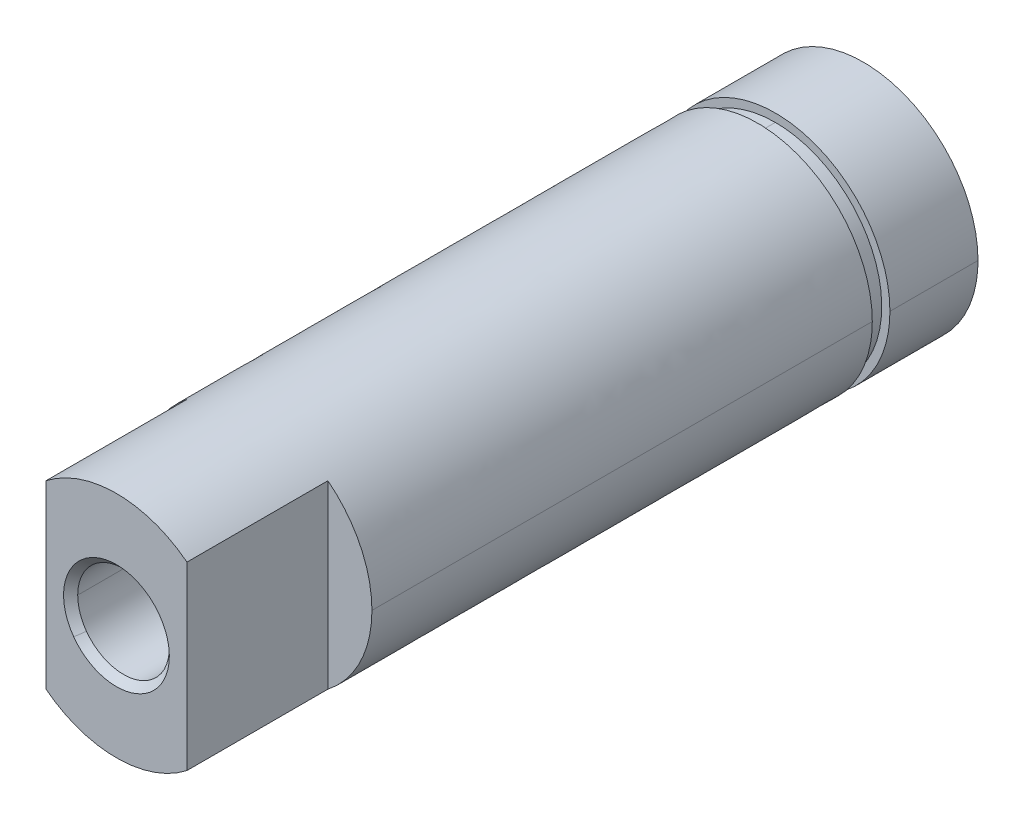
ISO-10303-21;
HEADER;
FILE_DESCRIPTION(('STEP AP214'),'2;1');
FILE_NAME('part.step','',(''),(''),'','','');
FILE_SCHEMA(('AUTOMOTIVE_DESIGN { 1 0 10303 214 1 1 1 1 }'));
ENDSEC;
DATA;
#1=APPLICATION_CONTEXT('core data for automotive mechanical design processes');
#2=APPLICATION_PROTOCOL_DEFINITION('international standard','automotive_design',2000,#1);
#3=PRODUCT_CONTEXT('',#1,'mechanical');
#4=PRODUCT('Part','Part','',(#3));
#5=PRODUCT_RELATED_PRODUCT_CATEGORY('part','',(#4));
#6=PRODUCT_DEFINITION_FORMATION('','',#4);
#7=PRODUCT_DEFINITION_CONTEXT('part definition',#1,'design');
#8=PRODUCT_DEFINITION('design','',#6,#7);
#9=PRODUCT_DEFINITION_SHAPE('','',#8);
#10=(LENGTH_UNIT() NAMED_UNIT(*) SI_UNIT(.MILLI.,.METRE.));
#11=(NAMED_UNIT(*) PLANE_ANGLE_UNIT() SI_UNIT($,.RADIAN.));
#12=(NAMED_UNIT(*) SI_UNIT($,.STERADIAN.) SOLID_ANGLE_UNIT());
#13=UNCERTAINTY_MEASURE_WITH_UNIT(LENGTH_MEASURE(1.E-05),#10,'distance_accuracy_value','');
#14=(GEOMETRIC_REPRESENTATION_CONTEXT(3) GLOBAL_UNCERTAINTY_ASSIGNED_CONTEXT((#13)) GLOBAL_UNIT_ASSIGNED_CONTEXT((#10,
#11,#12)) REPRESENTATION_CONTEXT('',''));
#15=CARTESIAN_POINT('',(0.,0.,0.));
#16=DIRECTION('',(0.,0.,1.));
#17=DIRECTION('',(1.,0.,0.));
#18=AXIS2_PLACEMENT_3D('',#15,#16,#17);
#19=CARTESIAN_POINT('',(3.25,0.,0.));
#20=CARTESIAN_POINT('',(3.25,-3.25,0.));
#21=CARTESIAN_POINT('',(0.,-3.25,0.));
#22=CARTESIAN_POINT('',(-3.25,-3.25,0.));
#23=CARTESIAN_POINT('',(-3.25,0.,0.));
#24=CARTESIAN_POINT('',(3.25,0.,2.5));
#25=CARTESIAN_POINT('',(3.25,-3.25,2.5));
#26=CARTESIAN_POINT('',(0.,-3.25,2.5));
#27=CARTESIAN_POINT('',(-3.25,-3.25,2.5));
#28=CARTESIAN_POINT('',(-3.25,0.,2.5));
#29=(BOUNDED_SURFACE() B_SPLINE_SURFACE(1,2,((#19,#20,#21,#22,#23),(#24,#25,#26,#27,#28)),
.UNSPECIFIED.,.F.,.F.,.F.) B_SPLINE_SURFACE_WITH_KNOTS((2,2),(3,2,3),(-0.384615384615385,
0.384615384615385),(-3.14159265358979,-1.5707963267949,0.),
.UNSPECIFIED.) GEOMETRIC_REPRESENTATION_ITEM() RATIONAL_B_SPLINE_SURFACE(((1.,0.707106781186548,
1.,0.707106781186548,1.),(1.,0.707106781186548,1.,0.707106781186548,1.))) REPRESENTATION_ITEM('') SURFACE());
#30=CARTESIAN_POINT('',(-3.25,0.,0.));
#31=CARTESIAN_POINT('',(-3.25,0.,2.5));
#32=(BOUNDED_CURVE() B_SPLINE_CURVE(1,(#30,#31),.UNSPECIFIED.,.F.,
.F.) B_SPLINE_CURVE_WITH_KNOTS((2,2),(-0.384615384615385,0.384615384615385),
.UNSPECIFIED.) CURVE() GEOMETRIC_REPRESENTATION_ITEM() RATIONAL_B_SPLINE_CURVE((1.,1.)) REPRESENTATION_ITEM(''));
#33=CARTESIAN_POINT('',(-3.25,0.,0.));
#34=VERTEX_POINT('',#33);
#35=CARTESIAN_POINT('',(-3.25,0.,2.5));
#36=VERTEX_POINT('',#35);
#37=EDGE_CURVE('E229',#34,#36,#32,.T.);
#38=CARTESIAN_POINT('',(-3.25,0.,0.));
#39=CARTESIAN_POINT('',(-3.25,-3.25,0.));
#40=CARTESIAN_POINT('',(0.,-3.25,0.));
#41=CARTESIAN_POINT('',(3.25,-3.25,0.));
#42=CARTESIAN_POINT('',(3.25,0.,0.));
#43=(BOUNDED_CURVE() B_SPLINE_CURVE(2,(#38,#39,#40,#41,#42),.UNSPECIFIED.,.F.,
.F.) B_SPLINE_CURVE_WITH_KNOTS((3,2,3),(-3.14159265358979,-1.5707963267949,0.),
.UNSPECIFIED.) CURVE() GEOMETRIC_REPRESENTATION_ITEM() RATIONAL_B_SPLINE_CURVE((1.,
0.707106781186548,1.,0.707106781186548,1.)) REPRESENTATION_ITEM(''));
#44=CARTESIAN_POINT('',(3.25,0.,0.));
#45=VERTEX_POINT('',#44);
#46=EDGE_CURVE('E202',#34,#45,#43,.T.);
#47=CARTESIAN_POINT('',(3.25,0.,0.));
#48=CARTESIAN_POINT('',(3.25,0.,2.5));
#49=(BOUNDED_CURVE() B_SPLINE_CURVE(1,(#47,#48),.UNSPECIFIED.,.F.,
.F.) B_SPLINE_CURVE_WITH_KNOTS((2,2),(-0.384615384615385,0.384615384615385),
.UNSPECIFIED.) CURVE() GEOMETRIC_REPRESENTATION_ITEM() RATIONAL_B_SPLINE_CURVE((1.,1.)) REPRESENTATION_ITEM(''));
#50=CARTESIAN_POINT('',(3.25,0.,2.5));
#51=VERTEX_POINT('',#50);
#52=EDGE_CURVE('E192',#45,#51,#49,.T.);
#53=CARTESIAN_POINT('',(-3.25,0.,2.5));
#54=CARTESIAN_POINT('',(-3.25,-3.25,2.5));
#55=CARTESIAN_POINT('',(0.,-3.25,2.5));
#56=CARTESIAN_POINT('',(3.25,-3.25,2.5));
#57=CARTESIAN_POINT('',(3.25,0.,2.5));
#58=(BOUNDED_CURVE() B_SPLINE_CURVE(2,(#53,#54,#55,#56,#57),.UNSPECIFIED.,.F.,
.F.) B_SPLINE_CURVE_WITH_KNOTS((3,2,3),(-3.14159265358979,-1.5707963267949,0.),
.UNSPECIFIED.) CURVE() GEOMETRIC_REPRESENTATION_ITEM() RATIONAL_B_SPLINE_CURVE((1.,
0.707106781186548,1.,0.707106781186548,1.)) REPRESENTATION_ITEM(''));
#59=EDGE_CURVE('E257',#36,#51,#58,.T.);
#60=ORIENTED_EDGE('',*,*,#37,.F.);
#61=ORIENTED_EDGE('',*,*,#46,.T.);
#62=ORIENTED_EDGE('',*,*,#52,.T.);
#63=ORIENTED_EDGE('',*,*,#59,.F.);
#64=EDGE_LOOP('',(#60,#61,#62,#63));
#65=FACE_BOUND('',#64,.T.);
#66=ADVANCED_FACE('F17',(#65),#29,.T.);
#67=CARTESIAN_POINT('',(0.,3.018225213,3.));
#68=CARTESIAN_POINT('',(-3.018225213,3.018225213,3.));
#69=CARTESIAN_POINT('',(-3.018225213,0.,3.));
#70=CARTESIAN_POINT('',(-3.018225213,-3.018225213,3.));
#71=CARTESIAN_POINT('',(0.,-3.018225213,3.));
#72=CARTESIAN_POINT('',(0.,3.018225213,2.5));
#73=CARTESIAN_POINT('',(-3.018225213,3.018225213,2.5));
#74=CARTESIAN_POINT('',(-3.018225213,0.,2.5));
#75=CARTESIAN_POINT('',(-3.018225213,-3.018225213,2.5));
#76=CARTESIAN_POINT('',(0.,-3.018225213,2.5));
#77=(BOUNDED_SURFACE() B_SPLINE_SURFACE(1,2,((#67,#68,#69,#70,#71),(#72,#73,#74,#75,#76)),
.UNSPECIFIED.,.F.,.F.,.F.) B_SPLINE_SURFACE_WITH_KNOTS((2,2),(3,2,3),(-0.0828301343859986,
0.0828301343859993),(-3.14159265358979,-1.5707963267949,0.),
.UNSPECIFIED.) GEOMETRIC_REPRESENTATION_ITEM() RATIONAL_B_SPLINE_SURFACE(((1.,0.707106781186548,
1.,0.707106781186548,1.),(1.,0.707106781186548,1.,0.707106781186548,1.))) REPRESENTATION_ITEM('') SURFACE());
#78=CARTESIAN_POINT('',(0.,-3.018225213,3.));
#79=CARTESIAN_POINT('',(0.,-3.018225213,2.5));
#80=(BOUNDED_CURVE() B_SPLINE_CURVE(1,(#78,#79),.UNSPECIFIED.,.F.,
.F.) B_SPLINE_CURVE_WITH_KNOTS((2,2),(-0.0828301343859986,0.0828301343859993),
.UNSPECIFIED.) CURVE() GEOMETRIC_REPRESENTATION_ITEM() RATIONAL_B_SPLINE_CURVE((1.,1.)) REPRESENTATION_ITEM(''));
#81=CARTESIAN_POINT('',(0.,-3.018225213,3.));
#82=VERTEX_POINT('',#81);
#83=CARTESIAN_POINT('',(0.,-3.018225213,2.5));
#84=VERTEX_POINT('',#83);
#85=EDGE_CURVE('E191',#82,#84,#80,.T.);
#86=CARTESIAN_POINT('',(0.,3.018225213,3.));
#87=CARTESIAN_POINT('',(-3.018225213,3.018225213,3.));
#88=CARTESIAN_POINT('',(-3.018225213,0.,3.));
#89=CARTESIAN_POINT('',(-3.018225213,-3.018225213,3.));
#90=CARTESIAN_POINT('',(0.,-3.018225213,3.));
#91=(BOUNDED_CURVE() B_SPLINE_CURVE(2,(#86,#87,#88,#89,#90),.UNSPECIFIED.,.F.,
.F.) B_SPLINE_CURVE_WITH_KNOTS((3,2,3),(1.5707963267949,3.14159265358979,4.71238898038469),
.UNSPECIFIED.) CURVE() GEOMETRIC_REPRESENTATION_ITEM() RATIONAL_B_SPLINE_CURVE((1.,
0.707106781186548,1.,0.707106781186548,1.)) REPRESENTATION_ITEM(''));
#92=CARTESIAN_POINT('',(0.,3.018225213,3.));
#93=VERTEX_POINT('',#92);
#94=EDGE_CURVE('E201',#93,#82,#91,.T.);
#95=CARTESIAN_POINT('',(0.,3.018225213,3.));
#96=CARTESIAN_POINT('',(0.,3.018225213,2.5));
#97=(BOUNDED_CURVE() B_SPLINE_CURVE(1,(#95,#96),.UNSPECIFIED.,.F.,
.F.) B_SPLINE_CURVE_WITH_KNOTS((2,2),(-0.0828301343859986,0.0828301343859993),
.UNSPECIFIED.) CURVE() GEOMETRIC_REPRESENTATION_ITEM() RATIONAL_B_SPLINE_CURVE((1.,1.)) REPRESENTATION_ITEM(''));
#98=CARTESIAN_POINT('',(0.,3.018225213,2.5));
#99=VERTEX_POINT('',#98);
#100=EDGE_CURVE('E23',#93,#99,#97,.T.);
#101=CARTESIAN_POINT('',(0.,3.018225213,2.5));
#102=CARTESIAN_POINT('',(-3.018225213,3.018225213,2.5));
#103=CARTESIAN_POINT('',(-3.018225213,0.,2.5));
#104=CARTESIAN_POINT('',(-3.018225213,-3.018225213,2.5));
#105=CARTESIAN_POINT('',(0.,-3.018225213,2.5));
#106=(BOUNDED_CURVE() B_SPLINE_CURVE(2,(#101,#102,#103,#104,#105),.UNSPECIFIED.,.F.,
.F.) B_SPLINE_CURVE_WITH_KNOTS((3,2,3),(1.5707963267949,3.14159265358979,4.71238898038469),
.UNSPECIFIED.) CURVE() GEOMETRIC_REPRESENTATION_ITEM() RATIONAL_B_SPLINE_CURVE((1.,
0.707106781186548,1.,0.707106781186548,1.)) REPRESENTATION_ITEM(''));
#107=EDGE_CURVE('E213',#99,#84,#106,.T.);
#108=ORIENTED_EDGE('',*,*,#85,.F.);
#109=ORIENTED_EDGE('',*,*,#94,.F.);
#110=ORIENTED_EDGE('',*,*,#100,.T.);
#111=ORIENTED_EDGE('',*,*,#107,.T.);
#112=EDGE_LOOP('',(#108,#109,#110,#111));
#113=FACE_BOUND('',#112,.T.);
#114=ADVANCED_FACE('F368',(#113),#77,.T.);
#115=CARTESIAN_POINT('',(-1.05172209268741,-0.764120827980221,21.));
#116=CARTESIAN_POINT('',(-0.287601264707204,-1.81584292066763,21.));
#117=CARTESIAN_POINT('',(0.764120827980206,-1.05172209268742,21.));
#118=CARTESIAN_POINT('',(1.81584292066762,-0.287601264707213,21.));
#119=CARTESIAN_POINT('',(1.05172209268741,0.764120827980197,21.));
#120=CARTESIAN_POINT('',(-1.21352549156242,-0.881677878438728,21.2));
#121=CARTESIAN_POINT('',(-0.331847613123702,-2.09520337000114,21.2));
#122=CARTESIAN_POINT('',(0.881677878438712,-1.21352549156243,21.2));
#123=CARTESIAN_POINT('',(2.09520337000113,-0.331847613123711,21.2));
#124=CARTESIAN_POINT('',(1.21352549156241,0.881677878438703,21.2));
#125=(BOUNDED_SURFACE() B_SPLINE_SURFACE(1,2,((#115,#116,#117,#118,#119),(#120,#121,#122,#123,
#124)),.UNSPECIFIED.,.F.,.F.,.F.) B_SPLINE_SURFACE_WITH_KNOTS((2,2),(3,2,3),
(-0.0214274782178067,0.192847303959953),(-3.14159265358979,-1.5707963267949,0.),
.UNSPECIFIED.) GEOMETRIC_REPRESENTATION_ITEM() RATIONAL_B_SPLINE_SURFACE(((1.,0.707106781186548,
1.,0.707106781186548,1.),(1.,0.707106781186548,1.,0.707106781186548,1.))) REPRESENTATION_ITEM('') SURFACE());
#126=CARTESIAN_POINT('',(1.05172209268742,0.764120827980206,21.));
#127=CARTESIAN_POINT('',(1.21352549156241,0.881677878438703,21.2));
#128=(BOUNDED_CURVE() B_SPLINE_CURVE(1,(#126,#127),.UNSPECIFIED.,.F.,
.F.) B_SPLINE_CURVE_WITH_KNOTS((2,2),(-0.0214274782178067,0.192847303959953),
.UNSPECIFIED.) CURVE() GEOMETRIC_REPRESENTATION_ITEM() RATIONAL_B_SPLINE_CURVE((1.,1.)) REPRESENTATION_ITEM(''));
#129=CARTESIAN_POINT('',(1.05172209268742,0.764120827980206,21.));
#130=VERTEX_POINT('',#129);
#131=CARTESIAN_POINT('',(1.21352549156241,0.881677878438703,21.2));
#132=VERTEX_POINT('',#131);
#133=EDGE_CURVE('E154',#130,#132,#128,.T.);
#134=CARTESIAN_POINT('',(1.3,0.,21.));
#135=CARTESIAN_POINT('',(1.3,0.422395605102777,21.));
#136=CARTESIAN_POINT('',(1.05172209268742,0.764120827980206,21.));
#137=(BOUNDED_CURVE() B_SPLINE_CURVE(2,(#134,#135,#136),.UNSPECIFIED.,.F.,
.F.) B_SPLINE_CURVE_WITH_KNOTS((3,3),(-6.28318530717959,-5.6470149373922),
.UNSPECIFIED.) CURVE() GEOMETRIC_REPRESENTATION_ITEM() RATIONAL_B_SPLINE_CURVE((1.,
0.881378645886596,0.858840265006243)) REPRESENTATION_ITEM(''));
#138=CARTESIAN_POINT('',(1.3,0.,21.));
#139=VERTEX_POINT('',#138);
#140=EDGE_CURVE('E140',#139,#130,#137,.T.);
#141=CARTESIAN_POINT('',(-1.05172209268741,-0.764120827980221,21.));
#142=CARTESIAN_POINT('',(-0.496555814625122,-1.52824165596043,21.));
#143=CARTESIAN_POINT('',(0.401722092687439,-1.2363734711837,21.));
#144=CARTESIAN_POINT('',(1.3,-0.944505286406964,21.));
#145=CARTESIAN_POINT('',(1.3,0.,21.));
#146=(BOUNDED_CURVE() B_SPLINE_CURVE(2,(#141,#142,#143,#144,#145),.UNSPECIFIED.,.F.,
.F.) B_SPLINE_CURVE_WITH_KNOTS((3,2,3),(-2.51327412287182,-1.25663706143591,0.),
.UNSPECIFIED.) CURVE() GEOMETRIC_REPRESENTATION_ITEM() RATIONAL_B_SPLINE_CURVE((1.,
0.809016994374948,1.,0.809016994374949,1.)) REPRESENTATION_ITEM(''));
#147=CARTESIAN_POINT('',(-1.05172209268741,-0.764120827980221,21.));
#148=VERTEX_POINT('',#147);
#149=EDGE_CURVE('E11',#148,#139,#146,.T.);
#150=CARTESIAN_POINT('',(-1.05172209268741,-0.764120827980221,21.));
#151=CARTESIAN_POINT('',(-1.21352549156242,-0.881677878438728,21.2));
#152=(BOUNDED_CURVE() B_SPLINE_CURVE(1,(#150,#151),.UNSPECIFIED.,.F.,
.F.) B_SPLINE_CURVE_WITH_KNOTS((2,2),(-0.0214274782178067,0.192847303959953),
.UNSPECIFIED.) CURVE() GEOMETRIC_REPRESENTATION_ITEM() RATIONAL_B_SPLINE_CURVE((1.,1.)) REPRESENTATION_ITEM(''));
#153=CARTESIAN_POINT('',(-1.21352549156242,-0.881677878438728,21.2));
#154=VERTEX_POINT('',#153);
#155=EDGE_CURVE('E301',#148,#154,#152,.T.);
#156=CARTESIAN_POINT('',(1.5,0.,21.2));
#157=CARTESIAN_POINT('',(1.5,-1.08981379200804,21.2));
#158=CARTESIAN_POINT('',(0.463525491562429,-1.42658477444273,21.2));
#159=CARTESIAN_POINT('',(-0.572949016875142,-1.76335575687742,21.2));
#160=CARTESIAN_POINT('',(-1.21352549156242,-0.881677878438728,21.2));
#161=(BOUNDED_CURVE() B_SPLINE_CURVE(2,(#156,#157,#158,#159,#160),.UNSPECIFIED.,.F.,
.F.) B_SPLINE_CURVE_WITH_KNOTS((3,2,3),(0.,1.2566370614359,2.51327412287182),
.UNSPECIFIED.) CURVE() GEOMETRIC_REPRESENTATION_ITEM() RATIONAL_B_SPLINE_CURVE((1.,
0.809016994374949,1.,0.80901699437495,1.)) REPRESENTATION_ITEM(''));
#162=CARTESIAN_POINT('',(1.5,0.,21.2));
#163=VERTEX_POINT('',#162);
#164=EDGE_CURVE('E284',#163,#154,#161,.T.);
#165=CARTESIAN_POINT('',(1.21352549156241,0.881677878438703,21.2));
#166=CARTESIAN_POINT('',(1.5,0.487379544349362,21.2));
#167=CARTESIAN_POINT('',(1.5,0.,21.2));
#168=(BOUNDED_CURVE() B_SPLINE_CURVE(2,(#165,#166,#167),.UNSPECIFIED.,.F.,
.F.) B_SPLINE_CURVE_WITH_KNOTS((3,3),(5.65486677646162,6.28318530717958),
.UNSPECIFIED.) CURVE() GEOMETRIC_REPRESENTATION_ITEM() RATIONAL_B_SPLINE_CURVE((0.904508497187473,
0.904508497187473,1.)) REPRESENTATION_ITEM(''));
#169=EDGE_CURVE('E32',#132,#163,#168,.T.);
#170=ORIENTED_EDGE('',*,*,#133,.F.);
#171=ORIENTED_EDGE('',*,*,#140,.F.);
#172=ORIENTED_EDGE('',*,*,#149,.F.);
#173=ORIENTED_EDGE('',*,*,#155,.T.);
#174=ORIENTED_EDGE('',*,*,#164,.F.);
#175=ORIENTED_EDGE('',*,*,#169,.F.);
#176=EDGE_LOOP('',(#170,#171,#172,#173,#174,#175));
#177=FACE_BOUND('',#176,.T.);
#178=ADVANCED_FACE('F155',(#177),#125,.T.);
#179=CARTESIAN_POINT('',(-1.3,0.,6.2));
#180=CARTESIAN_POINT('',(-1.3,-1.3,6.2));
#181=CARTESIAN_POINT('',(0.,-1.3,6.2));
#182=CARTESIAN_POINT('',(1.3,-1.3,6.2));
#183=CARTESIAN_POINT('',(1.3,0.,6.2));
#184=CARTESIAN_POINT('',(-1.3,0.,21.));
#185=CARTESIAN_POINT('',(-1.3,-1.3,21.));
#186=CARTESIAN_POINT('',(0.,-1.3,21.));
#187=CARTESIAN_POINT('',(1.3,-1.3,21.));
#188=CARTESIAN_POINT('',(1.3,0.,21.));
#189=(BOUNDED_SURFACE() B_SPLINE_SURFACE(1,2,((#179,#180,#181,#182,#183),(#184,#185,#186,#187,
#188)),.UNSPECIFIED.,.F.,.F.,.F.) B_SPLINE_SURFACE_WITH_KNOTS((2,2),(3,2,3),(-5.69230769230769,
5.69230769230769),(-3.14159265358979,-1.5707963267949,0.),
.UNSPECIFIED.) GEOMETRIC_REPRESENTATION_ITEM() RATIONAL_B_SPLINE_SURFACE(((1.,0.707106781186548,
1.,0.707106781186548,1.),(1.,0.707106781186548,1.,0.707106781186548,1.))) REPRESENTATION_ITEM('') SURFACE());
#190=CARTESIAN_POINT('',(1.3,0.,6.2));
#191=CARTESIAN_POINT('',(1.3,0.,21.));
#192=(BOUNDED_CURVE() B_SPLINE_CURVE(1,(#190,#191),.UNSPECIFIED.,.F.,
.F.) B_SPLINE_CURVE_WITH_KNOTS((2,2),(-5.69230769230769,5.69230769230769),
.UNSPECIFIED.) CURVE() GEOMETRIC_REPRESENTATION_ITEM() RATIONAL_B_SPLINE_CURVE((1.,1.)) REPRESENTATION_ITEM(''));
#193=CARTESIAN_POINT('',(1.3,0.,6.2));
#194=VERTEX_POINT('',#193);
#195=EDGE_CURVE('E148',#194,#139,#192,.T.);
#196=CARTESIAN_POINT('',(-1.3,0.,6.2));
#197=CARTESIAN_POINT('',(-1.3,-1.3,6.2));
#198=CARTESIAN_POINT('',(0.,-1.3,6.2));
#199=CARTESIAN_POINT('',(1.3,-1.3,6.2));
#200=CARTESIAN_POINT('',(1.3,0.,6.2));
#201=(BOUNDED_CURVE() B_SPLINE_CURVE(2,(#196,#197,#198,#199,#200),.UNSPECIFIED.,.F.,
.F.) B_SPLINE_CURVE_WITH_KNOTS((3,2,3),(-3.14159265358979,-1.5707963267949,0.),
.UNSPECIFIED.) CURVE() GEOMETRIC_REPRESENTATION_ITEM() RATIONAL_B_SPLINE_CURVE((1.,
0.707106781186548,1.,0.707106781186548,1.)) REPRESENTATION_ITEM(''));
#202=CARTESIAN_POINT('',(-1.3,0.,6.2));
#203=VERTEX_POINT('',#202);
#204=EDGE_CURVE('E302',#203,#194,#201,.T.);
#205=CARTESIAN_POINT('',(-1.3,0.,6.2));
#206=CARTESIAN_POINT('',(-1.3,0.,21.));
#207=(BOUNDED_CURVE() B_SPLINE_CURVE(1,(#205,#206),.UNSPECIFIED.,.F.,
.F.) B_SPLINE_CURVE_WITH_KNOTS((2,2),(-5.69230769230769,5.69230769230769),
.UNSPECIFIED.) CURVE() GEOMETRIC_REPRESENTATION_ITEM() RATIONAL_B_SPLINE_CURVE((1.,1.)) REPRESENTATION_ITEM(''));
#208=CARTESIAN_POINT('',(-1.3,0.,21.));
#209=VERTEX_POINT('',#208);
#210=EDGE_CURVE('E151',#203,#209,#207,.T.);
#211=CARTESIAN_POINT('',(-1.3,0.,21.));
#212=CARTESIAN_POINT('',(-1.3,-0.422395605102787,21.));
#213=CARTESIAN_POINT('',(-1.05172209268741,-0.764120827980221,21.));
#214=(BOUNDED_CURVE() B_SPLINE_CURVE(2,(#211,#212,#213),.UNSPECIFIED.,.F.,
.F.) B_SPLINE_CURVE_WITH_KNOTS((3,3),(-3.14159265358979,-2.51327412287182),
.UNSPECIFIED.) CURVE() GEOMETRIC_REPRESENTATION_ITEM() RATIONAL_B_SPLINE_CURVE((1.,
0.95105651629515,1.)) REPRESENTATION_ITEM(''));
#215=EDGE_CURVE('E165',#209,#148,#214,.T.);
#216=ORIENTED_EDGE('',*,*,#195,.F.);
#217=ORIENTED_EDGE('',*,*,#204,.F.);
#218=ORIENTED_EDGE('',*,*,#210,.T.);
#219=ORIENTED_EDGE('',*,*,#215,.T.);
#220=ORIENTED_EDGE('',*,*,#149,.T.);
#221=EDGE_LOOP('',(#216,#217,#218,#219,#220));
#222=FACE_BOUND('',#221,.T.);
#223=ADVANCED_FACE('F393',(#222),#189,.T.);
#224=CARTESIAN_POINT('',(3.25,0.,3.));
#225=CARTESIAN_POINT('',(3.25,-3.25,3.));
#226=CARTESIAN_POINT('',(0.,-3.25,3.));
#227=CARTESIAN_POINT('',(-3.25,-3.25,3.));
#228=CARTESIAN_POINT('',(-3.25,0.,3.));
#229=CARTESIAN_POINT('',(3.25,0.,21.2));
#230=CARTESIAN_POINT('',(3.25,-3.25,21.2));
#231=CARTESIAN_POINT('',(0.,-3.25,21.2));
#232=CARTESIAN_POINT('',(-3.25,-3.25,21.2));
#233=CARTESIAN_POINT('',(-3.25,0.,21.2));
#234=(BOUNDED_SURFACE() B_SPLINE_SURFACE(1,2,((#224,#225,#226,#227,#228),(#229,#230,#231,#232,
#233)),.UNSPECIFIED.,.F.,.F.,.F.) B_SPLINE_SURFACE_WITH_KNOTS((2,2),(3,2,3),(-2.8,2.8),
(-3.14159265358979,-1.5707963267949,0.),
.UNSPECIFIED.) GEOMETRIC_REPRESENTATION_ITEM() RATIONAL_B_SPLINE_SURFACE(((1.,0.707106781186548,
1.,0.707106781186548,1.),(1.,0.707106781186548,1.,0.707106781186548,1.))) REPRESENTATION_ITEM('') SURFACE());
#235=CARTESIAN_POINT('',(-3.25,0.,3.));
#236=CARTESIAN_POINT('',(-3.25,0.,17.2));
#237=(BOUNDED_CURVE() B_SPLINE_CURVE(1,(#235,#236),.UNSPECIFIED.,.F.,
.F.) B_SPLINE_CURVE_WITH_KNOTS((2,2),(-2.8,1.56923076923077),
.UNSPECIFIED.) CURVE() GEOMETRIC_REPRESENTATION_ITEM() RATIONAL_B_SPLINE_CURVE((1.,1.)) REPRESENTATION_ITEM(''));
#238=CARTESIAN_POINT('',(-3.25,0.,3.));
#239=VERTEX_POINT('',#238);
#240=CARTESIAN_POINT('',(-3.25,0.,17.2));
#241=VERTEX_POINT('',#240);
#242=EDGE_CURVE('E249',#239,#241,#237,.T.);
#243=CARTESIAN_POINT('',(-3.25,0.,3.));
#244=CARTESIAN_POINT('',(-3.25,-3.25,3.));
#245=CARTESIAN_POINT('',(0.,-3.25,3.));
#246=CARTESIAN_POINT('',(3.25,-3.25,3.));
#247=CARTESIAN_POINT('',(3.25,0.,3.));
#248=(BOUNDED_CURVE() B_SPLINE_CURVE(2,(#243,#244,#245,#246,#247),.UNSPECIFIED.,.F.,
.F.) B_SPLINE_CURVE_WITH_KNOTS((3,2,3),(-3.14159265358979,-1.5707963267949,0.),
.UNSPECIFIED.) CURVE() GEOMETRIC_REPRESENTATION_ITEM() RATIONAL_B_SPLINE_CURVE((1.,
0.707106781186548,1.,0.707106781186548,1.)) REPRESENTATION_ITEM(''));
#249=CARTESIAN_POINT('',(3.25,0.,3.));
#250=VERTEX_POINT('',#249);
#251=EDGE_CURVE('E193',#239,#250,#248,.T.);
#252=CARTESIAN_POINT('',(3.25,0.,3.));
#253=CARTESIAN_POINT('',(3.25,0.,17.2));
#254=(BOUNDED_CURVE() B_SPLINE_CURVE(1,(#252,#253),.UNSPECIFIED.,.F.,
.F.) B_SPLINE_CURVE_WITH_KNOTS((2,2),(-2.8,1.56923076923077),
.UNSPECIFIED.) CURVE() GEOMETRIC_REPRESENTATION_ITEM() RATIONAL_B_SPLINE_CURVE((1.,1.)) REPRESENTATION_ITEM(''));
#255=CARTESIAN_POINT('',(3.25,0.,17.2));
#256=VERTEX_POINT('',#255);
#257=EDGE_CURVE('E179',#250,#256,#254,.T.);
#258=CARTESIAN_POINT('',(3.25,0.,17.2));
#259=CARTESIAN_POINT('',(3.25,-1.58583761835474,17.2));
#260=CARTESIAN_POINT('',(2.,-2.561737691,17.2));
#261=(BOUNDED_CURVE() B_SPLINE_CURVE(2,(#258,#259,#260),.UNSPECIFIED.,.F.,
.F.) B_SPLINE_CURVE_WITH_KNOTS((3,3),(0.907922503144761,1.81584500619676),
.UNSPECIFIED.) CURVE() GEOMETRIC_REPRESENTATION_ITEM() RATIONAL_B_SPLINE_CURVE((1.,
0.898717034293257,1.)) REPRESENTATION_ITEM(''));
#262=CARTESIAN_POINT('',(2.,-2.561737691,17.2));
#263=VERTEX_POINT('',#262);
#264=EDGE_CURVE('E222',#256,#263,#261,.T.);
#265=CARTESIAN_POINT('',(2.,-2.561737691,17.2));
#266=CARTESIAN_POINT('',(2.,-2.561737691,21.2));
#267=(BOUNDED_CURVE() B_SPLINE_CURVE(1,(#265,#266),.UNSPECIFIED.,.F.,
.F.) B_SPLINE_CURVE_WITH_KNOTS((2,2),(0.,1.),
.UNSPECIFIED.) CURVE() GEOMETRIC_REPRESENTATION_ITEM() RATIONAL_B_SPLINE_CURVE((1.,1.)) REPRESENTATION_ITEM(''));
#268=CARTESIAN_POINT('',(2.,-2.561737691,21.2));
#269=VERTEX_POINT('',#268);
#270=EDGE_CURVE('E212',#263,#269,#267,.T.);
#271=CARTESIAN_POINT('',(-2.,-2.561737691,21.2));
#272=CARTESIAN_POINT('',(0.,-4.12317780801626,21.2));
#273=CARTESIAN_POINT('',(2.,-2.561737691,21.2));
#274=(BOUNDED_CURVE() B_SPLINE_CURVE(2,(#271,#272,#273),.UNSPECIFIED.,.F.,
.F.) B_SPLINE_CURVE_WITH_KNOTS((3,3),(-2.23367015053779,-0.907922503051999),
.UNSPECIFIED.) CURVE() GEOMETRIC_REPRESENTATION_ITEM() RATIONAL_B_SPLINE_CURVE((1.,
0.788226981939809,1.)) REPRESENTATION_ITEM(''));
#275=CARTESIAN_POINT('',(-2.,-2.561737691,21.2));
#276=VERTEX_POINT('',#275);
#277=EDGE_CURVE('E292',#276,#269,#274,.T.);
#278=CARTESIAN_POINT('',(-2.,-2.561737691,21.2));
#279=CARTESIAN_POINT('',(-2.,-2.561737691,17.2));
#280=(BOUNDED_CURVE() B_SPLINE_CURVE(1,(#278,#279),.UNSPECIFIED.,.F.,
.F.) B_SPLINE_CURVE_WITH_KNOTS((2,2),(0.,1.),
.UNSPECIFIED.) CURVE() GEOMETRIC_REPRESENTATION_ITEM() RATIONAL_B_SPLINE_CURVE((1.,1.)) REPRESENTATION_ITEM(''));
#281=CARTESIAN_POINT('',(-2.,-2.561737691,17.2));
#282=VERTEX_POINT('',#281);
#283=EDGE_CURVE('E282',#276,#282,#280,.T.);
#284=CARTESIAN_POINT('',(-2.,-2.561737691,17.2));
#285=CARTESIAN_POINT('',(-3.25,-1.58583761835474,17.2));
#286=CARTESIAN_POINT('',(-3.25,0.,17.2));
#287=(BOUNDED_CURVE() B_SPLINE_CURVE(2,(#284,#285,#286),.UNSPECIFIED.,.F.,
.F.) B_SPLINE_CURVE_WITH_KNOTS((3,3),(-0.907922503051999,0.),
.UNSPECIFIED.) CURVE() GEOMETRIC_REPRESENTATION_ITEM() RATIONAL_B_SPLINE_CURVE((1.,
0.898717034293258,1.)) REPRESENTATION_ITEM(''));
#288=EDGE_CURVE('E310',#282,#241,#287,.T.);
#289=ORIENTED_EDGE('',*,*,#242,.F.);
#290=ORIENTED_EDGE('',*,*,#251,.T.);
#291=ORIENTED_EDGE('',*,*,#257,.T.);
#292=ORIENTED_EDGE('',*,*,#264,.T.);
#293=ORIENTED_EDGE('',*,*,#270,.T.);
#294=ORIENTED_EDGE('',*,*,#277,.F.);
#295=ORIENTED_EDGE('',*,*,#283,.T.);
#296=ORIENTED_EDGE('',*,*,#288,.T.);
#297=EDGE_LOOP('',(#289,#290,#291,#292,#293,#294,#295,#296));
#298=FACE_BOUND('',#297,.T.);
#299=ADVANCED_FACE('F403',(#298),#234,.T.);
#300=CARTESIAN_POINT('',(-2.01,-4.13317780801626,21.2));
#301=CARTESIAN_POINT('',(-2.01,4.13317780801626,21.2));
#302=CARTESIAN_POINT('',(2.01,-4.13317780801626,21.2));
#303=CARTESIAN_POINT('',(2.01,4.13317780801626,21.2));
#304=(BOUNDED_SURFACE() B_SPLINE_SURFACE(1,1,((#300,#301),(#302,#303)),.UNSPECIFIED.,.F.,.F.,
.F.) B_SPLINE_SURFACE_WITH_KNOTS((2,2),(2,2),(-0.201,0.201),(-0.413317780801626,
0.413317780801626),
.UNSPECIFIED.) GEOMETRIC_REPRESENTATION_ITEM() RATIONAL_B_SPLINE_SURFACE(((1.,1.),(1.,1.))) REPRESENTATION_ITEM('') SURFACE());
#305=CARTESIAN_POINT('',(-1.21352549156242,-0.881677878438728,21.2));
#306=CARTESIAN_POINT('',(-1.85410196624969,0.,21.2));
#307=CARTESIAN_POINT('',(-1.21352549156243,0.881677878438701,21.2));
#308=CARTESIAN_POINT('',(-0.572949016875169,1.76335575687742,21.2));
#309=CARTESIAN_POINT('',(0.463525491562416,1.42658477444273,21.2));
#310=CARTESIAN_POINT('',(0.927050983124841,1.27597621252806,21.2));
#311=CARTESIAN_POINT('',(1.21352549156241,0.881677878438703,21.2));
#312=(BOUNDED_CURVE() B_SPLINE_CURVE(2,(#305,#306,#307,#308,#309,#310,#311),.UNSPECIFIED.,.F.,
.F.) B_SPLINE_CURVE_WITH_KNOTS((3,2,2,3),(2.51327412287182,3.76991118430774,5.02654824574366,
5.65486677646162),
.UNSPECIFIED.) CURVE() GEOMETRIC_REPRESENTATION_ITEM() RATIONAL_B_SPLINE_CURVE((1.,
0.809016994374946,1.,0.809016994374946,1.,0.904508497187473,0.904508497187473)) REPRESENTATION_ITEM(''));
#313=EDGE_CURVE('E159',#154,#132,#312,.T.);
#314=CARTESIAN_POINT('',(2.,2.561737691,21.2));
#315=CARTESIAN_POINT('',(2.,-2.561737691,21.2));
#316=(BOUNDED_CURVE() B_SPLINE_CURVE(1,(#314,#315),.UNSPECIFIED.,.F.,
.F.) B_SPLINE_CURVE_WITH_KNOTS((2,2),(0.,1.),
.UNSPECIFIED.) CURVE() GEOMETRIC_REPRESENTATION_ITEM() RATIONAL_B_SPLINE_CURVE((1.,1.)) REPRESENTATION_ITEM(''));
#317=CARTESIAN_POINT('',(2.,2.561737691,21.2));
#318=VERTEX_POINT('',#317);
#319=EDGE_CURVE('E203',#318,#269,#316,.T.);
#320=CARTESIAN_POINT('',(2.,2.561737691,21.2));
#321=CARTESIAN_POINT('',(0.,4.12317780801626,21.2));
#322=CARTESIAN_POINT('',(-2.,2.561737691,21.2));
#323=(BOUNDED_CURVE() B_SPLINE_CURVE(2,(#320,#321,#322),.UNSPECIFIED.,.F.,
.F.) B_SPLINE_CURVE_WITH_KNOTS((3,3),(0.907922503051999,2.23367015053779),
.UNSPECIFIED.) CURVE() GEOMETRIC_REPRESENTATION_ITEM() RATIONAL_B_SPLINE_CURVE((1.,
0.788226981939809,1.)) REPRESENTATION_ITEM(''));
#324=CARTESIAN_POINT('',(-2.,2.561737691,21.2));
#325=VERTEX_POINT('',#324);
#326=EDGE_CURVE('E478',#318,#325,#323,.T.);
#327=CARTESIAN_POINT('',(-2.,-2.561737691,21.2));
#328=CARTESIAN_POINT('',(-2.,2.561737691,21.2));
#329=(BOUNDED_CURVE() B_SPLINE_CURVE(1,(#327,#328),.UNSPECIFIED.,.F.,
.F.) B_SPLINE_CURVE_WITH_KNOTS((2,2),(0.,1.),
.UNSPECIFIED.) CURVE() GEOMETRIC_REPRESENTATION_ITEM() RATIONAL_B_SPLINE_CURVE((1.,1.)) REPRESENTATION_ITEM(''));
#330=EDGE_CURVE('E283',#276,#325,#329,.T.);
#331=ORIENTED_EDGE('',*,*,#164,.T.);
#332=ORIENTED_EDGE('',*,*,#313,.T.);
#333=ORIENTED_EDGE('',*,*,#169,.T.);
#334=EDGE_LOOP('',(#331,#332,#333));
#335=FACE_BOUND('',#334,.T.);
#336=ORIENTED_EDGE('',*,*,#319,.F.);
#337=ORIENTED_EDGE('',*,*,#326,.T.);
#338=ORIENTED_EDGE('',*,*,#330,.F.);
#339=ORIENTED_EDGE('',*,*,#277,.T.);
#340=EDGE_LOOP('',(#336,#337,#338,#339));
#341=FACE_BOUND('',#340,.T.);
#342=ADVANCED_FACE('F414',(#335,#341),#304,.T.);
#343=CARTESIAN_POINT('',(-1.31,-1.31,6.2));
#344=CARTESIAN_POINT('',(-1.31,1.31,6.2));
#345=CARTESIAN_POINT('',(1.31,-1.31,6.2));
#346=CARTESIAN_POINT('',(1.31,1.31,6.2));
#347=(BOUNDED_SURFACE() B_SPLINE_SURFACE(1,1,((#343,#344),(#345,#346)),.UNSPECIFIED.,.F.,.F.,
.F.) B_SPLINE_SURFACE_WITH_KNOTS((2,2),(2,2),(-0.131,0.131),(-0.131,0.131),
.UNSPECIFIED.) GEOMETRIC_REPRESENTATION_ITEM() RATIONAL_B_SPLINE_SURFACE(((1.,1.),(1.,1.))) REPRESENTATION_ITEM('') SURFACE());
#348=CARTESIAN_POINT('',(1.3,0.,6.2));
#349=CARTESIAN_POINT('',(1.3,1.3,6.2));
#350=CARTESIAN_POINT('',(0.,1.3,6.2));
#351=CARTESIAN_POINT('',(-1.3,1.3,6.2));
#352=CARTESIAN_POINT('',(-1.3,0.,6.2));
#353=(BOUNDED_CURVE() B_SPLINE_CURVE(2,(#348,#349,#350,#351,#352),.UNSPECIFIED.,.F.,
.F.) B_SPLINE_CURVE_WITH_KNOTS((3,2,3),(-6.28318530717959,-4.71238898038469,-3.14159265358979),
.UNSPECIFIED.) CURVE() GEOMETRIC_REPRESENTATION_ITEM() RATIONAL_B_SPLINE_CURVE((1.,
0.707106781186548,1.,0.707106781186548,1.)) REPRESENTATION_ITEM(''));
#354=EDGE_CURVE('E300',#194,#203,#353,.T.);
#355=ORIENTED_EDGE('',*,*,#354,.T.);
#356=ORIENTED_EDGE('',*,*,#204,.T.);
#357=EDGE_LOOP('',(#355,#356));
#358=FACE_BOUND('',#357,.T.);
#359=ADVANCED_FACE('F850',(#358),#347,.T.);
#360=CARTESIAN_POINT('',(-3.26,-2.57173769130438,17.2));
#361=CARTESIAN_POINT('',(-3.26,2.57173769130438,17.2));
#362=CARTESIAN_POINT('',(-1.99,-2.57173769130438,17.2));
#363=CARTESIAN_POINT('',(-1.99,2.57173769130438,17.2));
#364=(BOUNDED_SURFACE() B_SPLINE_SURFACE(1,1,((#360,#361),(#362,#363)),.UNSPECIFIED.,.F.,.F.,
.F.) B_SPLINE_SURFACE_WITH_KNOTS((2,2),(2,2),(0.199,0.326),(-0.257173769130438,
0.257173769130438),
.UNSPECIFIED.) GEOMETRIC_REPRESENTATION_ITEM() RATIONAL_B_SPLINE_SURFACE(((1.,1.),(1.,1.))) REPRESENTATION_ITEM('') SURFACE());
#365=CARTESIAN_POINT('',(-2.,-2.561737691,17.2));
#366=CARTESIAN_POINT('',(-2.,2.561737691,17.2));
#367=(BOUNDED_CURVE() B_SPLINE_CURVE(1,(#365,#366),.UNSPECIFIED.,.F.,
.F.) B_SPLINE_CURVE_WITH_KNOTS((2,2),(0.,1.),
.UNSPECIFIED.) CURVE() GEOMETRIC_REPRESENTATION_ITEM() RATIONAL_B_SPLINE_CURVE((1.,1.)) REPRESENTATION_ITEM(''));
#368=CARTESIAN_POINT('',(-2.,2.561737691,17.2));
#369=VERTEX_POINT('',#368);
#370=EDGE_CURVE('E274',#282,#369,#367,.T.);
#371=CARTESIAN_POINT('',(-3.25,0.,17.2));
#372=CARTESIAN_POINT('',(-3.25,1.58583761835474,17.2));
#373=CARTESIAN_POINT('',(-2.,2.561737691,17.2));
#374=(BOUNDED_CURVE() B_SPLINE_CURVE(2,(#371,#372,#373),.UNSPECIFIED.,.F.,
.F.) B_SPLINE_CURVE_WITH_KNOTS((3,3),(0.,0.907922503051999),
.UNSPECIFIED.) CURVE() GEOMETRIC_REPRESENTATION_ITEM() RATIONAL_B_SPLINE_CURVE((1.,
0.898717034293257,1.)) REPRESENTATION_ITEM(''));
#375=EDGE_CURVE('E537',#241,#369,#374,.T.);
#376=ORIENTED_EDGE('',*,*,#370,.T.);
#377=ORIENTED_EDGE('',*,*,#375,.F.);
#378=ORIENTED_EDGE('',*,*,#288,.F.);
#379=EDGE_LOOP('',(#376,#377,#378));
#380=FACE_BOUND('',#379,.T.);
#381=ADVANCED_FACE('F836',(#380),#364,.T.);
#382=CARTESIAN_POINT('',(-2.,-2.571737691,17.19));
#383=CARTESIAN_POINT('',(-2.,2.571737691,17.19));
#384=CARTESIAN_POINT('',(-2.,-2.571737691,21.21));
#385=CARTESIAN_POINT('',(-2.,2.571737691,21.21));
#386=(BOUNDED_SURFACE() B_SPLINE_SURFACE(1,1,((#382,#383),(#384,#385)),.UNSPECIFIED.,.F.,.F.,
.F.) B_SPLINE_SURFACE_WITH_KNOTS((2,2),(2,2),(-0.401,0.000999999999999945),(-0.5133475382,
0.001),.UNSPECIFIED.) GEOMETRIC_REPRESENTATION_ITEM() RATIONAL_B_SPLINE_SURFACE(((1.,1.),(1.,1.))) REPRESENTATION_ITEM('') SURFACE());
#387=CARTESIAN_POINT('',(-2.,2.561737691,17.2));
#388=CARTESIAN_POINT('',(-2.,2.561737691,21.2));
#389=(BOUNDED_CURVE() B_SPLINE_CURVE(1,(#387,#388),.UNSPECIFIED.,.F.,
.F.) B_SPLINE_CURVE_WITH_KNOTS((2,2),(0.,1.),
.UNSPECIFIED.) CURVE() GEOMETRIC_REPRESENTATION_ITEM() RATIONAL_B_SPLINE_CURVE((1.,1.)) REPRESENTATION_ITEM(''));
#390=EDGE_CURVE('E546',#369,#325,#389,.T.);
#391=ORIENTED_EDGE('',*,*,#330,.T.);
#392=ORIENTED_EDGE('',*,*,#390,.F.);
#393=ORIENTED_EDGE('',*,*,#370,.F.);
#394=ORIENTED_EDGE('',*,*,#283,.F.);
#395=EDGE_LOOP('',(#391,#392,#393,#394));
#396=FACE_BOUND('',#395,.T.);
#397=ADVANCED_FACE('F646',(#396),#386,.T.);
#398=CARTESIAN_POINT('',(1.99,-2.57173769130437,17.2));
#399=CARTESIAN_POINT('',(1.99,2.57173769130437,17.2));
#400=CARTESIAN_POINT('',(3.26,-2.57173769130437,17.2));
#401=CARTESIAN_POINT('',(3.26,2.57173769130437,17.2));
#402=(BOUNDED_SURFACE() B_SPLINE_SURFACE(1,1,((#398,#399),(#400,#401)),.UNSPECIFIED.,.F.,.F.,
.F.) B_SPLINE_SURFACE_WITH_KNOTS((2,2),(2,2),(-0.326,-0.199),(-0.257173769130437,
0.257173769130437),
.UNSPECIFIED.) GEOMETRIC_REPRESENTATION_ITEM() RATIONAL_B_SPLINE_SURFACE(((1.,1.),(1.,1.))) REPRESENTATION_ITEM('') SURFACE());
#403=CARTESIAN_POINT('',(2.,2.561737691,17.2));
#404=CARTESIAN_POINT('',(2.,-2.561737691,17.2));
#405=(BOUNDED_CURVE() B_SPLINE_CURVE(1,(#403,#404),.UNSPECIFIED.,.F.,
.F.) B_SPLINE_CURVE_WITH_KNOTS((2,2),(0.,1.),
.UNSPECIFIED.) CURVE() GEOMETRIC_REPRESENTATION_ITEM() RATIONAL_B_SPLINE_CURVE((1.,1.)) REPRESENTATION_ITEM(''));
#406=CARTESIAN_POINT('',(2.,2.561737691,17.2));
#407=VERTEX_POINT('',#406);
#408=EDGE_CURVE('E214',#407,#263,#405,.T.);
#409=CARTESIAN_POINT('',(2.,2.561737691,17.2));
#410=CARTESIAN_POINT('',(3.25,1.58583761835474,17.2));
#411=CARTESIAN_POINT('',(3.25,0.,17.2));
#412=(BOUNDED_CURVE() B_SPLINE_CURVE(2,(#409,#410,#411),.UNSPECIFIED.,.F.,
.F.) B_SPLINE_CURVE_WITH_KNOTS((3,3),(9.27622870035965E-11,0.907922503144761),
.UNSPECIFIED.) CURVE() GEOMETRIC_REPRESENTATION_ITEM() RATIONAL_B_SPLINE_CURVE((1.,
0.898717034293257,1.)) REPRESENTATION_ITEM(''));
#413=EDGE_CURVE('E481',#407,#256,#412,.T.);
#414=ORIENTED_EDGE('',*,*,#408,.T.);
#415=ORIENTED_EDGE('',*,*,#264,.F.);
#416=ORIENTED_EDGE('',*,*,#413,.F.);
#417=EDGE_LOOP('',(#414,#415,#416));
#418=FACE_BOUND('',#417,.T.);
#419=ADVANCED_FACE('F359',(#418),#402,.T.);
#420=CARTESIAN_POINT('',(2.,-2.571737691,21.21));
#421=CARTESIAN_POINT('',(2.,2.571737691,21.21));
#422=CARTESIAN_POINT('',(2.,-2.571737691,17.19));
#423=CARTESIAN_POINT('',(2.,2.571737691,17.19));
#424=(BOUNDED_SURFACE() B_SPLINE_SURFACE(1,1,((#420,#421),(#422,#423)),.UNSPECIFIED.,.F.,.F.,
.F.) B_SPLINE_SURFACE_WITH_KNOTS((2,2),(2,2),(-0.001,0.401),(-0.5380439907,-0.0236964525),
.UNSPECIFIED.) GEOMETRIC_REPRESENTATION_ITEM() RATIONAL_B_SPLINE_SURFACE(((1.,1.),(1.,1.))) REPRESENTATION_ITEM('') SURFACE());
#425=CARTESIAN_POINT('',(2.,2.561737691,21.2));
#426=CARTESIAN_POINT('',(2.,2.561737691,17.2));
#427=(BOUNDED_CURVE() B_SPLINE_CURVE(1,(#425,#426),.UNSPECIFIED.,.F.,
.F.) B_SPLINE_CURVE_WITH_KNOTS((2,2),(0.,1.),
.UNSPECIFIED.) CURVE() GEOMETRIC_REPRESENTATION_ITEM() RATIONAL_B_SPLINE_CURVE((1.,1.)) REPRESENTATION_ITEM(''));
#428=EDGE_CURVE('E488',#318,#407,#427,.T.);
#429=ORIENTED_EDGE('',*,*,#319,.T.);
#430=ORIENTED_EDGE('',*,*,#270,.F.);
#431=ORIENTED_EDGE('',*,*,#408,.F.);
#432=ORIENTED_EDGE('',*,*,#428,.F.);
#433=EDGE_LOOP('',(#429,#430,#431,#432));
#434=FACE_BOUND('',#433,.T.);
#435=ADVANCED_FACE('F349',(#434),#424,.T.);
#436=CARTESIAN_POINT('',(-3.26,-3.26,2.5));
#437=CARTESIAN_POINT('',(-3.26,3.26,2.5));
#438=CARTESIAN_POINT('',(3.26,-3.26,2.5));
#439=CARTESIAN_POINT('',(3.26,3.26,2.5));
#440=(BOUNDED_SURFACE() B_SPLINE_SURFACE(1,1,((#436,#437),(#438,#439)),.UNSPECIFIED.,.F.,.F.,
.F.) B_SPLINE_SURFACE_WITH_KNOTS((2,2),(2,2),(-0.326,0.326),(-0.651,0.001),
.UNSPECIFIED.) GEOMETRIC_REPRESENTATION_ITEM() RATIONAL_B_SPLINE_SURFACE(((1.,1.),(1.,1.))) REPRESENTATION_ITEM('') SURFACE());
#441=CARTESIAN_POINT('',(0.,-3.018225213,2.5));
#442=CARTESIAN_POINT('',(3.018225213,-3.018225213,2.5));
#443=CARTESIAN_POINT('',(3.018225213,0.,2.5));
#444=CARTESIAN_POINT('',(3.018225213,3.018225213,2.5));
#445=CARTESIAN_POINT('',(0.,3.018225213,2.5));
#446=(BOUNDED_CURVE() B_SPLINE_CURVE(2,(#441,#442,#443,#444,#445),.UNSPECIFIED.,.F.,
.F.) B_SPLINE_CURVE_WITH_KNOTS((3,2,3),(-1.5707963267949,0.,1.5707963267949),
.UNSPECIFIED.) CURVE() GEOMETRIC_REPRESENTATION_ITEM() RATIONAL_B_SPLINE_CURVE((1.,
0.707106781186548,1.,0.707106781186548,1.)) REPRESENTATION_ITEM(''));
#447=EDGE_CURVE('E174',#84,#99,#446,.T.);
#448=CARTESIAN_POINT('',(3.25,0.,2.5));
#449=CARTESIAN_POINT('',(3.25,3.25,2.5));
#450=CARTESIAN_POINT('',(0.,3.25,2.5));
#451=CARTESIAN_POINT('',(-3.25,3.25,2.5));
#452=CARTESIAN_POINT('',(-3.25,0.,2.5));
#453=(BOUNDED_CURVE() B_SPLINE_CURVE(2,(#448,#449,#450,#451,#452),.UNSPECIFIED.,.F.,
.F.) B_SPLINE_CURVE_WITH_KNOTS((3,2,3),(0.,1.5707963267949,3.14159265358979),
.UNSPECIFIED.) CURVE() GEOMETRIC_REPRESENTATION_ITEM() RATIONAL_B_SPLINE_CURVE((1.,
0.707106781186548,1.,0.707106781186548,1.)) REPRESENTATION_ITEM(''));
#454=EDGE_CURVE('E238',#51,#36,#453,.T.);
#455=ORIENTED_EDGE('',*,*,#447,.F.);
#456=ORIENTED_EDGE('',*,*,#107,.F.);
#457=EDGE_LOOP('',(#455,#456));
#458=FACE_BOUND('',#457,.T.);
#459=ORIENTED_EDGE('',*,*,#59,.T.);
#460=ORIENTED_EDGE('',*,*,#454,.T.);
#461=EDGE_LOOP('',(#459,#460));
#462=FACE_BOUND('',#461,.T.);
#463=ADVANCED_FACE('F346',(#458,#462),#440,.T.);
#464=CARTESIAN_POINT('',(3.26,-3.26,3.));
#465=CARTESIAN_POINT('',(3.26,3.26,3.));
#466=CARTESIAN_POINT('',(-3.26,-3.26,3.));
#467=CARTESIAN_POINT('',(-3.26,3.26,3.));
#468=(BOUNDED_SURFACE() B_SPLINE_SURFACE(1,1,((#464,#465),(#466,#467)),.UNSPECIFIED.,.F.,.F.,
.F.) B_SPLINE_SURFACE_WITH_KNOTS((2,2),(2,2),(-0.326,0.326),(-0.651,0.001),
.UNSPECIFIED.) GEOMETRIC_REPRESENTATION_ITEM() RATIONAL_B_SPLINE_SURFACE(((1.,1.),(1.,1.))) REPRESENTATION_ITEM('') SURFACE());
#469=CARTESIAN_POINT('',(0.,-3.018225213,3.));
#470=CARTESIAN_POINT('',(3.018225213,-3.018225213,3.));
#471=CARTESIAN_POINT('',(3.018225213,0.,3.));
#472=CARTESIAN_POINT('',(3.018225213,3.018225213,3.));
#473=CARTESIAN_POINT('',(0.,3.018225213,3.));
#474=(BOUNDED_CURVE() B_SPLINE_CURVE(2,(#469,#470,#471,#472,#473),.UNSPECIFIED.,.F.,
.F.) B_SPLINE_CURVE_WITH_KNOTS((3,2,3),(-1.5707963267949,0.,1.5707963267949),
.UNSPECIFIED.) CURVE() GEOMETRIC_REPRESENTATION_ITEM() RATIONAL_B_SPLINE_CURVE((1.,
0.707106781186548,1.,0.707106781186548,1.)) REPRESENTATION_ITEM(''));
#475=EDGE_CURVE('E183',#82,#93,#474,.T.);
#476=CARTESIAN_POINT('',(3.25,0.,3.));
#477=CARTESIAN_POINT('',(3.25,3.25,3.));
#478=CARTESIAN_POINT('',(0.,3.25,3.));
#479=CARTESIAN_POINT('',(-3.25,3.25,3.));
#480=CARTESIAN_POINT('',(-3.25,0.,3.));
#481=(BOUNDED_CURVE() B_SPLINE_CURVE(2,(#476,#477,#478,#479,#480),.UNSPECIFIED.,.F.,
.F.) B_SPLINE_CURVE_WITH_KNOTS((3,2,3),(0.,1.5707963267949,3.14159265358979),
.UNSPECIFIED.) CURVE() GEOMETRIC_REPRESENTATION_ITEM() RATIONAL_B_SPLINE_CURVE((1.,
0.707106781186548,1.,0.707106781186548,1.)) REPRESENTATION_ITEM(''));
#482=EDGE_CURVE('E240',#250,#239,#481,.T.);
#483=ORIENTED_EDGE('',*,*,#475,.T.);
#484=ORIENTED_EDGE('',*,*,#94,.T.);
#485=EDGE_LOOP('',(#483,#484));
#486=FACE_BOUND('',#485,.T.);
#487=ORIENTED_EDGE('',*,*,#251,.F.);
#488=ORIENTED_EDGE('',*,*,#482,.F.);
#489=EDGE_LOOP('',(#487,#488));
#490=FACE_BOUND('',#489,.T.);
#491=ADVANCED_FACE('F348',(#486,#490),#468,.T.);
#492=CARTESIAN_POINT('',(3.26,-3.26,0.));
#493=CARTESIAN_POINT('',(3.26,3.26,0.));
#494=CARTESIAN_POINT('',(-3.26,-3.26,0.));
#495=CARTESIAN_POINT('',(-3.26,3.26,0.));
#496=(BOUNDED_SURFACE() B_SPLINE_SURFACE(1,1,((#492,#493),(#494,#495)),.UNSPECIFIED.,.F.,.F.,
.F.) B_SPLINE_SURFACE_WITH_KNOTS((2,2),(2,2),(-0.326,0.326),(-0.326,0.326),
.UNSPECIFIED.) GEOMETRIC_REPRESENTATION_ITEM() RATIONAL_B_SPLINE_SURFACE(((1.,1.),(1.,1.))) REPRESENTATION_ITEM('') SURFACE());
#497=CARTESIAN_POINT('',(3.25,0.,0.));
#498=CARTESIAN_POINT('',(3.25,3.25,0.));
#499=CARTESIAN_POINT('',(0.,3.25,0.));
#500=CARTESIAN_POINT('',(-3.25,3.25,0.));
#501=CARTESIAN_POINT('',(-3.25,0.,0.));
#502=(BOUNDED_CURVE() B_SPLINE_CURVE(2,(#497,#498,#499,#500,#501),.UNSPECIFIED.,.F.,
.F.) B_SPLINE_CURVE_WITH_KNOTS((3,2,3),(0.,1.5707963267949,3.14159265358979),
.UNSPECIFIED.) CURVE() GEOMETRIC_REPRESENTATION_ITEM() RATIONAL_B_SPLINE_CURVE((1.,
0.707106781186548,1.,0.707106781186548,1.)) REPRESENTATION_ITEM(''));
#503=EDGE_CURVE('E239',#45,#34,#502,.T.);
#504=ORIENTED_EDGE('',*,*,#46,.F.);
#505=ORIENTED_EDGE('',*,*,#503,.F.);
#506=EDGE_LOOP('',(#504,#505));
#507=FACE_BOUND('',#506,.T.);
#508=ADVANCED_FACE('F336',(#507),#496,.T.);
#509=CARTESIAN_POINT('',(-3.25,0.,3.));
#510=CARTESIAN_POINT('',(-3.25,3.25,3.));
#511=CARTESIAN_POINT('',(0.,3.25,3.));
#512=CARTESIAN_POINT('',(3.25,3.25,3.));
#513=CARTESIAN_POINT('',(3.25,0.,3.));
#514=CARTESIAN_POINT('',(-3.25,0.,21.2));
#515=CARTESIAN_POINT('',(-3.25,3.25,21.2));
#516=CARTESIAN_POINT('',(0.,3.25,21.2));
#517=CARTESIAN_POINT('',(3.25,3.25,21.2));
#518=CARTESIAN_POINT('',(3.25,0.,21.2));
#519=(BOUNDED_SURFACE() B_SPLINE_SURFACE(1,2,((#509,#510,#511,#512,#513),(#514,#515,#516,#517,
#518)),.UNSPECIFIED.,.F.,.F.,.F.) B_SPLINE_SURFACE_WITH_KNOTS((2,2),(3,2,3),(-2.8,2.8),(0.,
1.5707963267949,3.14159265358979),
.UNSPECIFIED.) GEOMETRIC_REPRESENTATION_ITEM() RATIONAL_B_SPLINE_SURFACE(((1.,0.707106781186548,
1.,0.707106781186548,1.),(1.,0.707106781186548,1.,0.707106781186548,1.))) REPRESENTATION_ITEM('') SURFACE());
#520=ORIENTED_EDGE('',*,*,#482,.T.);
#521=ORIENTED_EDGE('',*,*,#242,.T.);
#522=ORIENTED_EDGE('',*,*,#375,.T.);
#523=ORIENTED_EDGE('',*,*,#390,.T.);
#524=ORIENTED_EDGE('',*,*,#326,.F.);
#525=ORIENTED_EDGE('',*,*,#428,.T.);
#526=ORIENTED_EDGE('',*,*,#413,.T.);
#527=ORIENTED_EDGE('',*,*,#257,.F.);
#528=EDGE_LOOP('',(#520,#521,#522,#523,#524,#525,#526,#527));
#529=FACE_BOUND('',#528,.T.);
#530=ADVANCED_FACE('F416',(#529),#519,.T.);
#531=CARTESIAN_POINT('',(1.3,0.,6.2));
#532=CARTESIAN_POINT('',(1.3,1.3,6.2));
#533=CARTESIAN_POINT('',(0.,1.3,6.2));
#534=CARTESIAN_POINT('',(-1.3,1.3,6.2));
#535=CARTESIAN_POINT('',(-1.3,0.,6.2));
#536=CARTESIAN_POINT('',(1.3,0.,21.));
#537=CARTESIAN_POINT('',(1.3,1.3,21.));
#538=CARTESIAN_POINT('',(0.,1.3,21.));
#539=CARTESIAN_POINT('',(-1.3,1.3,21.));
#540=CARTESIAN_POINT('',(-1.3,0.,21.));
#541=(BOUNDED_SURFACE() B_SPLINE_SURFACE(1,2,((#531,#532,#533,#534,#535),(#536,#537,#538,#539,
#540)),.UNSPECIFIED.,.F.,.F.,.F.) B_SPLINE_SURFACE_WITH_KNOTS((2,2),(3,2,3),(-5.69230769230769,
5.69230769230769),(0.,1.5707963267949,3.14159265358979),
.UNSPECIFIED.) GEOMETRIC_REPRESENTATION_ITEM() RATIONAL_B_SPLINE_SURFACE(((1.,0.707106781186548,
1.,0.707106781186548,1.),(1.,0.707106781186548,1.,0.707106781186548,1.))) REPRESENTATION_ITEM('') SURFACE());
#542=CARTESIAN_POINT('',(1.05172209268742,0.764120827980206,21.));
#543=CARTESIAN_POINT('',(0.662383084342759,1.3,21.));
#544=CARTESIAN_POINT('',(0.,1.3,21.));
#545=CARTESIAN_POINT('',(-1.3,1.3,21.));
#546=CARTESIAN_POINT('',(-1.3,0.,21.));
#547=(BOUNDED_CURVE() B_SPLINE_CURVE(2,(#542,#543,#544,#545,#546),.UNSPECIFIED.,.F.,
.F.) B_SPLINE_CURVE_WITH_KNOTS((3,2,3),(-5.6470149373922,-4.71238898038469,-3.14159265358979),
.UNSPECIFIED.) CURVE() GEOMETRIC_REPRESENTATION_ITEM() RATIONAL_B_SPLINE_CURVE((0.858840265006243,
0.825728135299952,1.,0.707106781186548,1.)) REPRESENTATION_ITEM(''));
#548=EDGE_CURVE('E146',#130,#209,#547,.T.);
#549=ORIENTED_EDGE('',*,*,#354,.F.);
#550=ORIENTED_EDGE('',*,*,#195,.T.);
#551=ORIENTED_EDGE('',*,*,#140,.T.);
#552=ORIENTED_EDGE('',*,*,#548,.T.);
#553=ORIENTED_EDGE('',*,*,#210,.F.);
#554=EDGE_LOOP('',(#549,#550,#551,#552,#553));
#555=FACE_BOUND('',#554,.T.);
#556=ADVANCED_FACE('F143',(#555),#541,.T.);
#557=CARTESIAN_POINT('',(1.05172209268741,0.764120827980197,21.));
#558=CARTESIAN_POINT('',(0.287601264707198,1.81584292066761,21.));
#559=CARTESIAN_POINT('',(-0.764120827980213,1.0517220926874,21.));
#560=CARTESIAN_POINT('',(-1.81584292066762,0.287601264707189,21.));
#561=CARTESIAN_POINT('',(-1.05172209268741,-0.764120827980221,21.));
#562=CARTESIAN_POINT('',(1.21352549156241,0.881677878438703,21.2));
#563=CARTESIAN_POINT('',(0.331847613123695,2.09520337000112,21.2));
#564=CARTESIAN_POINT('',(-0.881677878438719,1.2135254915624,21.2));
#565=CARTESIAN_POINT('',(-2.09520337000113,0.331847613123686,21.2));
#566=CARTESIAN_POINT('',(-1.21352549156242,-0.881677878438728,21.2));
#567=(BOUNDED_SURFACE() B_SPLINE_SURFACE(1,2,((#557,#558,#559,#560,#561),(#562,#563,#564,#565,
#566)),.UNSPECIFIED.,.F.,.F.,.F.) B_SPLINE_SURFACE_WITH_KNOTS((2,2),(3,2,3),
(-0.0214274782178067,0.192847303959953),(0.,1.5707963267949,3.14159265358979),
.UNSPECIFIED.) GEOMETRIC_REPRESENTATION_ITEM() RATIONAL_B_SPLINE_SURFACE(((1.,0.707106781186548,
1.,0.707106781186548,1.),(1.,0.707106781186548,1.,0.707106781186548,1.))) REPRESENTATION_ITEM('') SURFACE());
#568=ORIENTED_EDGE('',*,*,#548,.F.);
#569=ORIENTED_EDGE('',*,*,#133,.T.);
#570=ORIENTED_EDGE('',*,*,#313,.F.);
#571=ORIENTED_EDGE('',*,*,#155,.F.);
#572=ORIENTED_EDGE('',*,*,#215,.F.);
#573=EDGE_LOOP('',(#568,#569,#570,#571,#572));
#574=FACE_BOUND('',#573,.T.);
#575=ADVANCED_FACE('F162',(#574),#567,.T.);
#576=CARTESIAN_POINT('',(0.,-3.018225213,3.));
#577=CARTESIAN_POINT('',(3.018225213,-3.018225213,3.));
#578=CARTESIAN_POINT('',(3.018225213,0.,3.));
#579=CARTESIAN_POINT('',(3.018225213,3.018225213,3.));
#580=CARTESIAN_POINT('',(0.,3.018225213,3.));
#581=CARTESIAN_POINT('',(0.,-3.018225213,2.5));
#582=CARTESIAN_POINT('',(3.018225213,-3.018225213,2.5));
#583=CARTESIAN_POINT('',(3.018225213,0.,2.5));
#584=CARTESIAN_POINT('',(3.018225213,3.018225213,2.5));
#585=CARTESIAN_POINT('',(0.,3.018225213,2.5));
#586=(BOUNDED_SURFACE() B_SPLINE_SURFACE(1,2,((#576,#577,#578,#579,#580),(#581,#582,#583,#584,
#585)),.UNSPECIFIED.,.F.,.F.,.F.) B_SPLINE_SURFACE_WITH_KNOTS((2,2),(3,2,3),
(-0.0828301343859986,0.0828301343859993),(0.,1.5707963267949,3.14159265358979),
.UNSPECIFIED.) GEOMETRIC_REPRESENTATION_ITEM() RATIONAL_B_SPLINE_SURFACE(((1.,0.707106781186548,
1.,0.707106781186548,1.),(1.,0.707106781186548,1.,0.707106781186548,1.))) REPRESENTATION_ITEM('') SURFACE());
#587=ORIENTED_EDGE('',*,*,#475,.F.);
#588=ORIENTED_EDGE('',*,*,#85,.T.);
#589=ORIENTED_EDGE('',*,*,#447,.T.);
#590=ORIENTED_EDGE('',*,*,#100,.F.);
#591=EDGE_LOOP('',(#587,#588,#589,#590));
#592=FACE_BOUND('',#591,.T.);
#593=ADVANCED_FACE('F444',(#592),#586,.T.);
#594=CARTESIAN_POINT('',(-3.25,0.,0.));
#595=CARTESIAN_POINT('',(-3.25,3.25,0.));
#596=CARTESIAN_POINT('',(0.,3.25,0.));
#597=CARTESIAN_POINT('',(3.25,3.25,0.));
#598=CARTESIAN_POINT('',(3.25,0.,0.));
#599=CARTESIAN_POINT('',(-3.25,0.,2.5));
#600=CARTESIAN_POINT('',(-3.25,3.25,2.5));
#601=CARTESIAN_POINT('',(0.,3.25,2.5));
#602=CARTESIAN_POINT('',(3.25,3.25,2.5));
#603=CARTESIAN_POINT('',(3.25,0.,2.5));
#604=(BOUNDED_SURFACE() B_SPLINE_SURFACE(1,2,((#594,#595,#596,#597,#598),(#599,#600,#601,#602,
#603)),.UNSPECIFIED.,.F.,.F.,.F.) B_SPLINE_SURFACE_WITH_KNOTS((2,2),(3,2,3),(-0.384615384615385,
0.384615384615385),(0.,1.5707963267949,3.14159265358979),
.UNSPECIFIED.) GEOMETRIC_REPRESENTATION_ITEM() RATIONAL_B_SPLINE_SURFACE(((1.,0.707106781186548,
1.,0.707106781186548,1.),(1.,0.707106781186548,1.,0.707106781186548,1.))) REPRESENTATION_ITEM('') SURFACE());
#605=ORIENTED_EDGE('',*,*,#503,.T.);
#606=ORIENTED_EDGE('',*,*,#37,.T.);
#607=ORIENTED_EDGE('',*,*,#454,.F.);
#608=ORIENTED_EDGE('',*,*,#52,.F.);
#609=EDGE_LOOP('',(#605,#606,#607,#608));
#610=FACE_BOUND('',#609,.T.);
#611=ADVANCED_FACE('F19',(#610),#604,.T.);
#612=CLOSED_SHELL('',(#66,#114,#178,#223,#299,#342,#359,#381,#397,#419,#435,#463,#491,#508,#530,
#556,#575,#593,#611));
#613=MANIFOLD_SOLID_BREP('B1',#612);
#614=ADVANCED_BREP_SHAPE_REPRESENTATION('',(#18,#613),#14);
#615=SHAPE_DEFINITION_REPRESENTATION(#9,#614);
ENDSEC;
END-ISO-10303-21;
